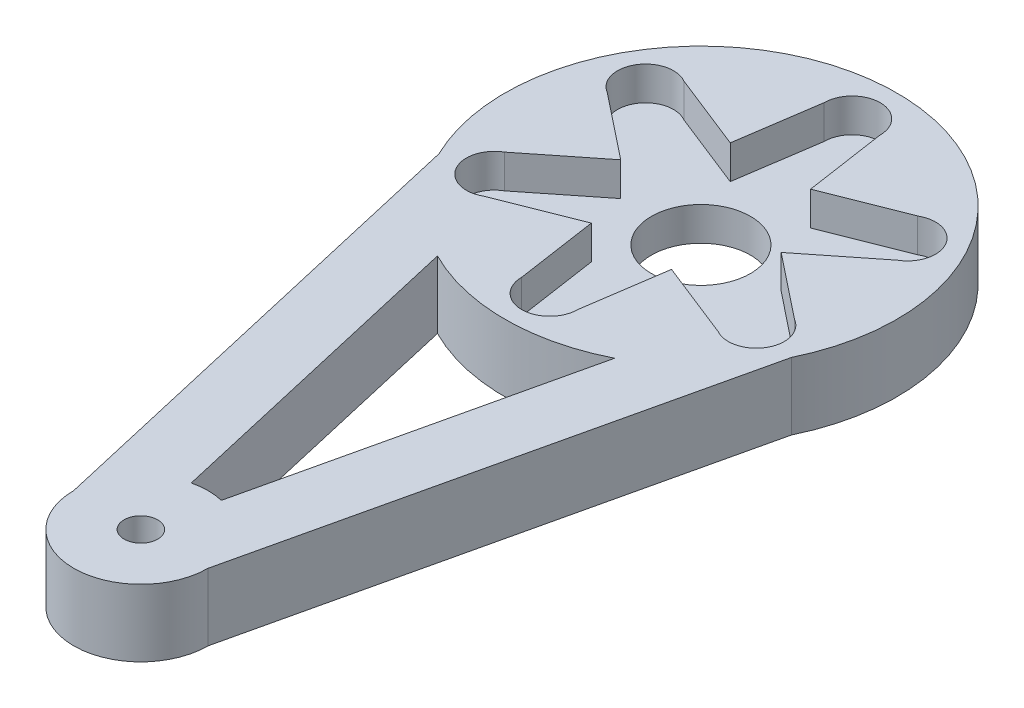
ISO-10303-21;
HEADER;
FILE_DESCRIPTION(('STEP AP214'),'2;1');
FILE_NAME('part.step','',(''),(''),'','','');
FILE_SCHEMA(('AUTOMOTIVE_DESIGN { 1 0 10303 214 1 1 1 1 }'));
ENDSEC;
DATA;
#1=APPLICATION_CONTEXT('core data for automotive mechanical design processes');
#2=APPLICATION_PROTOCOL_DEFINITION('international standard','automotive_design',2000,#1);
#3=PRODUCT_CONTEXT('',#1,'mechanical');
#4=PRODUCT('Part','Part','',(#3));
#5=PRODUCT_RELATED_PRODUCT_CATEGORY('part','',(#4));
#6=PRODUCT_DEFINITION_FORMATION('','',#4);
#7=PRODUCT_DEFINITION_CONTEXT('part definition',#1,'design');
#8=PRODUCT_DEFINITION('design','',#6,#7);
#9=PRODUCT_DEFINITION_SHAPE('','',#8);
#10=(LENGTH_UNIT() NAMED_UNIT(*) SI_UNIT(.MILLI.,.METRE.));
#11=(NAMED_UNIT(*) PLANE_ANGLE_UNIT() SI_UNIT($,.RADIAN.));
#12=(NAMED_UNIT(*) SI_UNIT($,.STERADIAN.) SOLID_ANGLE_UNIT());
#13=UNCERTAINTY_MEASURE_WITH_UNIT(LENGTH_MEASURE(1.E-05),#10,'distance_accuracy_value','');
#14=(GEOMETRIC_REPRESENTATION_CONTEXT(3) GLOBAL_UNCERTAINTY_ASSIGNED_CONTEXT((#13)) GLOBAL_UNIT_ASSIGNED_CONTEXT((#10,
#11,#12)) REPRESENTATION_CONTEXT('',''));
#15=CARTESIAN_POINT('',(0.,0.,0.));
#16=DIRECTION('',(0.,0.,1.));
#17=DIRECTION('',(1.,0.,0.));
#18=AXIS2_PLACEMENT_3D('',#15,#16,#17);
#19=CARTESIAN_POINT('',(0.,6.,0.));
#20=DIRECTION('',(0.,-1.,0.));
#21=DIRECTION('',(0.,0.,-1.));
#22=AXIS2_PLACEMENT_3D('',#19,#20,#21);
#23=CYLINDRICAL_SURFACE('',#22,17.5);
#24=DIRECTION('',(0.,-1.,0.));
#25=VECTOR('',#24,1.);
#26=CARTESIAN_POINT('',(15.7415234115301,6.,7.64555038465191));
#27=LINE('',#26,#25);
#28=CARTESIAN_POINT('',(15.7415234115301,6.,7.64555038465191));
#29=VERTEX_POINT('',#28);
#30=CARTESIAN_POINT('',(15.7415234115301,0.,7.64555038465191));
#31=VERTEX_POINT('',#30);
#32=EDGE_CURVE('E286',#29,#31,#27,.T.);
#33=ORIENTED_EDGE('',*,*,#32,.T.);
#34=CARTESIAN_POINT('',(0.,0.,0.));
#35=DIRECTION('',(0.,1.,0.));
#36=DIRECTION('',(0.,0.,1.));
#37=AXIS2_PLACEMENT_3D('',#34,#35,#36);
#38=CIRCLE('',#37,17.5);
#39=CARTESIAN_POINT('',(-15.7415234115301,0.,7.64555038465188));
#40=VERTEX_POINT('',#39);
#41=EDGE_CURVE('E396',#31,#40,#38,.T.);
#42=ORIENTED_EDGE('',*,*,#41,.T.);
#43=DIRECTION('',(0.,-1.,0.));
#44=VECTOR('',#43,1.);
#45=CARTESIAN_POINT('',(-15.7415234115301,6.,7.64555038465191));
#46=LINE('',#45,#44);
#47=CARTESIAN_POINT('',(-15.7415234115301,6.,7.64555038465188));
#48=VERTEX_POINT('',#47);
#49=EDGE_CURVE('E117',#48,#40,#46,.T.);
#50=ORIENTED_EDGE('',*,*,#49,.F.);
#51=CARTESIAN_POINT('',(0.,6.,0.));
#52=DIRECTION('',(0.,1.,0.));
#53=DIRECTION('',(0.,0.,1.));
#54=AXIS2_PLACEMENT_3D('',#51,#52,#53);
#55=CIRCLE('',#54,17.5);
#56=EDGE_CURVE('E442',#29,#48,#55,.T.);
#57=ORIENTED_EDGE('',*,*,#56,.F.);
#58=EDGE_LOOP('',(#33,#42,#50,#57));
#59=FACE_BOUND('',#58,.T.);
#60=ADVANCED_FACE('F94',(#59),#23,.T.);
#61=CARTESIAN_POINT('',(-7.90957870538803,0.,15.6105273678781));
#62=VERTEX_POINT('',#61);
#63=CARTESIAN_POINT('',(7.90957870538804,0.,15.6105273678781));
#64=VERTEX_POINT('',#63);
#65=EDGE_CURVE('E389',#62,#64,#38,.T.);
#66=ORIENTED_EDGE('',*,*,#65,.T.);
#67=DIRECTION('',(0.,-1.,0.));
#68=VECTOR('',#67,1.);
#69=CARTESIAN_POINT('',(7.90957870538803,6.,15.6105273678781));
#70=LINE('',#69,#68);
#71=CARTESIAN_POINT('',(7.90957870538804,6.,15.6105273678781));
#72=VERTEX_POINT('',#71);
#73=EDGE_CURVE('E326',#72,#64,#70,.T.);
#74=ORIENTED_EDGE('',*,*,#73,.F.);
#75=CARTESIAN_POINT('',(-7.90957870538803,6.,15.6105273678781));
#76=VERTEX_POINT('',#75);
#77=EDGE_CURVE('E109',#76,#72,#55,.T.);
#78=ORIENTED_EDGE('',*,*,#77,.F.);
#79=DIRECTION('',(0.,-1.,0.));
#80=VECTOR('',#79,1.);
#81=CARTESIAN_POINT('',(-7.90957870538803,6.,15.6105273678781));
#82=LINE('',#81,#80);
#83=EDGE_CURVE('E333',#76,#62,#82,.T.);
#84=ORIENTED_EDGE('',*,*,#83,.T.);
#85=EDGE_LOOP('',(#66,#74,#78,#84));
#86=FACE_BOUND('',#85,.T.);
#87=ADVANCED_FACE('F569',(#86),#23,.T.);
#88=CARTESIAN_POINT('',(-11.6913429510899,6.,-6.74999999999999));
#89=DIRECTION('',(0.,-1.,0.));
#90=DIRECTION('',(0.,0.,-1.));
#91=AXIS2_PLACEMENT_3D('',#88,#89,#90);
#92=CYLINDRICAL_SURFACE('',#91,2.5);
#93=CARTESIAN_POINT('',(-11.6913429510899,3.,-6.74999999999999));
#94=DIRECTION('',(0.,1.,0.));
#95=DIRECTION('',(0.,0.,1.));
#96=AXIS2_PLACEMENT_3D('',#93,#94,#95);
#97=CIRCLE('',#96,2.5);
#98=CARTESIAN_POINT('',(-10.4413429510899,3.,-8.91506350946109));
#99=VERTEX_POINT('',#98);
#100=CARTESIAN_POINT('',(-12.9413429510899,3.,-4.58493649053889));
#101=VERTEX_POINT('',#100);
#102=EDGE_CURVE('E363',#99,#101,#97,.T.);
#103=ORIENTED_EDGE('',*,*,#102,.F.);
#104=DIRECTION('',(0.,-1.,0.));
#105=VECTOR('',#104,1.);
#106=CARTESIAN_POINT('',(-10.4413429510899,6.,-8.91506350946109));
#107=LINE('',#106,#105);
#108=CARTESIAN_POINT('',(-10.4413429510899,6.,-8.91506350946109));
#109=VERTEX_POINT('',#108);
#110=EDGE_CURVE('E12',#109,#99,#107,.T.);
#111=ORIENTED_EDGE('',*,*,#110,.F.);
#112=CARTESIAN_POINT('',(-11.6913429510899,6.,-6.74999999999999));
#113=DIRECTION('',(0.,1.,0.));
#114=DIRECTION('',(0.,0.,1.));
#115=AXIS2_PLACEMENT_3D('',#112,#113,#114);
#116=CIRCLE('',#115,2.5);
#117=CARTESIAN_POINT('',(-12.9413429510899,6.,-4.58493649053889));
#118=VERTEX_POINT('',#117);
#119=EDGE_CURVE('E392',#109,#118,#116,.T.);
#120=ORIENTED_EDGE('',*,*,#119,.T.);
#121=DIRECTION('',(0.,-1.,0.));
#122=VECTOR('',#121,1.);
#123=CARTESIAN_POINT('',(-12.9413429510899,6.,-4.58493649053889));
#124=LINE('',#123,#122);
#125=EDGE_CURVE('E444',#118,#101,#124,.T.);
#126=ORIENTED_EDGE('',*,*,#125,.T.);
#127=EDGE_LOOP('',(#103,#111,#120,#126));
#128=FACE_BOUND('',#127,.T.);
#129=ADVANCED_FACE('F96',(#128),#92,.F.);
#130=CARTESIAN_POINT('',(1.63672705202787,6.,-4.13959239881188));
#131=DIRECTION('',(0.367686867782864,0.,-0.929949658454707));
#132=DIRECTION('',(-0.929949658454707,0.,-0.367686867782864));
#133=AXIS2_PLACEMENT_3D('',#130,#131,#132);
#134=PLANE('',#133);
#135=ORIENTED_EDGE('',*,*,#110,.T.);
#136=DIRECTION('',(0.929949658454707,0.,0.367686867782864));
#137=VECTOR('',#136,1.);
#138=CARTESIAN_POINT('',(1.63672705202787,3.,-4.13959239881188));
#139=LINE('',#138,#137);
#140=CARTESIAN_POINT('',(-3.58109149415789,3.,-6.20263241443421));
#141=VERTEX_POINT('',#140);
#142=EDGE_CURVE('E361',#99,#141,#139,.T.);
#143=ORIENTED_EDGE('',*,*,#142,.T.);
#144=DIRECTION('',(0.,-1.,0.));
#145=VECTOR('',#144,1.);
#146=CARTESIAN_POINT('',(-3.58109149415789,6.,-6.20263241443421));
#147=LINE('',#146,#145);
#148=CARTESIAN_POINT('',(-3.58109149415789,6.,-6.20263241443421));
#149=VERTEX_POINT('',#148);
#150=EDGE_CURVE('E102',#149,#141,#147,.T.);
#151=ORIENTED_EDGE('',*,*,#150,.F.);
#152=DIRECTION('',(0.929949658454707,0.,0.367686867782864));
#153=VECTOR('',#152,1.);
#154=CARTESIAN_POINT('',(1.63672705202787,6.,-4.13959239881188));
#155=LINE('',#154,#153);
#156=EDGE_CURVE('E395',#109,#149,#155,.T.);
#157=ORIENTED_EDGE('',*,*,#156,.F.);
#158=EDGE_LOOP('',(#135,#143,#151,#157));
#159=FACE_BOUND('',#158,.T.);
#160=ADVANCED_FACE('F513',(#159),#134,.F.);
#161=CARTESIAN_POINT('',(-4.40335570469799,6.,-0.65234899328859));
#162=DIRECTION('',(0.989203462353871,0.,0.146548661089462));
#163=DIRECTION('',(0.146548661089462,0.,-0.989203462353871));
#164=AXIS2_PLACEMENT_3D('',#161,#162,#163);
#165=PLANE('',#164);
#166=DIRECTION('',(-0.146548661089462,0.,0.989203462353871));
#167=VECTOR('',#166,1.);
#168=CARTESIAN_POINT('',(-4.40335570469799,3.,-0.65234899328859));
#169=LINE('',#168,#167);
#170=CARTESIAN_POINT('',(-2.5,3.,-13.5));
#171=VERTEX_POINT('',#170);
#172=EDGE_CURVE('E358',#171,#141,#169,.T.);
#173=ORIENTED_EDGE('',*,*,#172,.F.);
#174=DIRECTION('',(0.,-1.,0.));
#175=VECTOR('',#174,1.);
#176=CARTESIAN_POINT('',(-2.5,6.,-13.5));
#177=LINE('',#176,#175);
#178=CARTESIAN_POINT('',(-2.5,6.,-13.5));
#179=VERTEX_POINT('',#178);
#180=EDGE_CURVE('E488',#179,#171,#177,.T.);
#181=ORIENTED_EDGE('',*,*,#180,.F.);
#182=DIRECTION('',(-0.146548661089462,0.,0.989203462353871));
#183=VECTOR('',#182,1.);
#184=CARTESIAN_POINT('',(-4.40335570469799,6.,-0.65234899328859));
#185=LINE('',#184,#183);
#186=EDGE_CURVE('E398',#179,#149,#185,.T.);
#187=ORIENTED_EDGE('',*,*,#186,.T.);
#188=ORIENTED_EDGE('',*,*,#150,.T.);
#189=EDGE_LOOP('',(#173,#181,#187,#188));
#190=FACE_BOUND('',#189,.T.);
#191=ADVANCED_FACE('F493',(#190),#165,.T.);
#192=CARTESIAN_POINT('',(0.,6.,-13.5));
#193=DIRECTION('',(0.,-1.,0.));
#194=DIRECTION('',(0.,0.,-1.));
#195=AXIS2_PLACEMENT_3D('',#192,#193,#194);
#196=CYLINDRICAL_SURFACE('',#195,2.5);
#197=CARTESIAN_POINT('',(0.,3.,-13.5));
#198=DIRECTION('',(0.,1.,0.));
#199=DIRECTION('',(0.,0.,1.));
#200=AXIS2_PLACEMENT_3D('',#197,#198,#199);
#201=CIRCLE('',#200,2.5);
#202=CARTESIAN_POINT('',(2.5,3.,-13.5));
#203=VERTEX_POINT('',#202);
#204=EDGE_CURVE('E355',#203,#171,#201,.T.);
#205=ORIENTED_EDGE('',*,*,#204,.F.);
#206=DIRECTION('',(0.,-1.,0.));
#207=VECTOR('',#206,1.);
#208=CARTESIAN_POINT('',(2.5,6.,-13.5));
#209=LINE('',#208,#207);
#210=CARTESIAN_POINT('',(2.5,6.,-13.5));
#211=VERTEX_POINT('',#210);
#212=EDGE_CURVE('E485',#211,#203,#209,.T.);
#213=ORIENTED_EDGE('',*,*,#212,.F.);
#214=CARTESIAN_POINT('',(0.,6.,-13.5));
#215=DIRECTION('',(0.,1.,0.));
#216=DIRECTION('',(0.,0.,1.));
#217=AXIS2_PLACEMENT_3D('',#214,#215,#216);
#218=CIRCLE('',#217,2.5);
#219=EDGE_CURVE('E401',#211,#179,#218,.T.);
#220=ORIENTED_EDGE('',*,*,#219,.T.);
#221=ORIENTED_EDGE('',*,*,#180,.T.);
#222=EDGE_LOOP('',(#205,#213,#220,#221));
#223=FACE_BOUND('',#222,.T.);
#224=ADVANCED_FACE('F503',(#223),#196,.F.);
#225=CARTESIAN_POINT('',(4.40335570469799,6.,-0.65234899328859));
#226=DIRECTION('',(0.989203462353871,0.,-0.146548661089462));
#227=DIRECTION('',(-0.146548661089462,0.,-0.989203462353871));
#228=AXIS2_PLACEMENT_3D('',#225,#226,#227);
#229=PLANE('',#228);
#230=ORIENTED_EDGE('',*,*,#212,.T.);
#231=DIRECTION('',(0.146548661089462,0.,0.989203462353871));
#232=VECTOR('',#231,1.);
#233=CARTESIAN_POINT('',(4.40335570469799,3.,-0.65234899328859));
#234=LINE('',#233,#232);
#235=CARTESIAN_POINT('',(3.58109149415789,3.,-6.20263241443422));
#236=VERTEX_POINT('',#235);
#237=EDGE_CURVE('E353',#203,#236,#234,.T.);
#238=ORIENTED_EDGE('',*,*,#237,.T.);
#239=DIRECTION('',(0.,-1.,0.));
#240=VECTOR('',#239,1.);
#241=CARTESIAN_POINT('',(3.58109149415789,6.,-6.20263241443422));
#242=LINE('',#241,#240);
#243=CARTESIAN_POINT('',(3.58109149415789,6.,-6.20263241443422));
#244=VERTEX_POINT('',#243);
#245=EDGE_CURVE('E482',#244,#236,#242,.T.);
#246=ORIENTED_EDGE('',*,*,#245,.F.);
#247=DIRECTION('',(0.146548661089462,0.,0.989203462353871));
#248=VECTOR('',#247,1.);
#249=CARTESIAN_POINT('',(4.40335570469799,6.,-0.65234899328859));
#250=LINE('',#249,#248);
#251=EDGE_CURVE('E404',#211,#244,#250,.T.);
#252=ORIENTED_EDGE('',*,*,#251,.F.);
#253=EDGE_LOOP('',(#230,#238,#246,#252));
#254=FACE_BOUND('',#253,.T.);
#255=ADVANCED_FACE('F506',(#254),#229,.F.);
#256=CARTESIAN_POINT('',(-1.63672705202787,6.,-4.13959239881188));
#257=DIRECTION('',(0.367686867782865,0.,0.929949658454707));
#258=DIRECTION('',(0.929949658454707,0.,-0.367686867782865));
#259=AXIS2_PLACEMENT_3D('',#256,#257,#258);
#260=PLANE('',#259);
#261=DIRECTION('',(-0.929949658454707,0.,0.367686867782865));
#262=VECTOR('',#261,1.);
#263=CARTESIAN_POINT('',(-1.63672705202787,3.,-4.13959239881188));
#264=LINE('',#263,#262);
#265=CARTESIAN_POINT('',(10.4413429510899,3.,-8.9150635094611));
#266=VERTEX_POINT('',#265);
#267=EDGE_CURVE('E350',#266,#236,#264,.T.);
#268=ORIENTED_EDGE('',*,*,#267,.F.);
#269=DIRECTION('',(0.,-1.,0.));
#270=VECTOR('',#269,1.);
#271=CARTESIAN_POINT('',(10.4413429510899,6.,-8.9150635094611));
#272=LINE('',#271,#270);
#273=CARTESIAN_POINT('',(10.4413429510899,6.,-8.9150635094611));
#274=VERTEX_POINT('',#273);
#275=EDGE_CURVE('E479',#274,#266,#272,.T.);
#276=ORIENTED_EDGE('',*,*,#275,.F.);
#277=DIRECTION('',(-0.929949658454707,0.,0.367686867782865));
#278=VECTOR('',#277,1.);
#279=CARTESIAN_POINT('',(-1.63672705202787,6.,-4.13959239881188));
#280=LINE('',#279,#278);
#281=EDGE_CURVE('E406',#274,#244,#280,.T.);
#282=ORIENTED_EDGE('',*,*,#281,.T.);
#283=ORIENTED_EDGE('',*,*,#245,.T.);
#284=EDGE_LOOP('',(#268,#276,#282,#283));
#285=FACE_BOUND('',#284,.T.);
#286=ADVANCED_FACE('F559',(#285),#260,.T.);
#287=CARTESIAN_POINT('',(11.6913429510899,6.,-6.75));
#288=DIRECTION('',(0.,-1.,0.));
#289=DIRECTION('',(0.,0.,-1.));
#290=AXIS2_PLACEMENT_3D('',#287,#288,#289);
#291=CYLINDRICAL_SURFACE('',#290,2.5);
#292=CARTESIAN_POINT('',(11.6913429510899,3.,-6.75));
#293=DIRECTION('',(0.,1.,0.));
#294=DIRECTION('',(0.,0.,1.));
#295=AXIS2_PLACEMENT_3D('',#292,#293,#294);
#296=CIRCLE('',#295,2.5);
#297=CARTESIAN_POINT('',(12.9413429510899,3.,-4.58493649053891));
#298=VERTEX_POINT('',#297);
#299=EDGE_CURVE('E347',#298,#266,#296,.T.);
#300=ORIENTED_EDGE('',*,*,#299,.F.);
#301=DIRECTION('',(0.,-1.,0.));
#302=VECTOR('',#301,1.);
#303=CARTESIAN_POINT('',(12.9413429510899,6.,-4.58493649053891));
#304=LINE('',#303,#302);
#305=CARTESIAN_POINT('',(12.9413429510899,6.,-4.58493649053891));
#306=VERTEX_POINT('',#305);
#307=EDGE_CURVE('E476',#306,#298,#304,.T.);
#308=ORIENTED_EDGE('',*,*,#307,.F.);
#309=CARTESIAN_POINT('',(11.6913429510899,6.,-6.75));
#310=DIRECTION('',(0.,1.,0.));
#311=DIRECTION('',(0.,0.,1.));
#312=AXIS2_PLACEMENT_3D('',#309,#310,#311);
#313=CIRCLE('',#312,2.5);
#314=EDGE_CURVE('E409',#306,#274,#313,.T.);
#315=ORIENTED_EDGE('',*,*,#314,.T.);
#316=ORIENTED_EDGE('',*,*,#275,.T.);
#317=EDGE_LOOP('',(#300,#308,#315,#316));
#318=FACE_BOUND('',#317,.T.);
#319=ADVANCED_FACE('F557',(#318),#291,.F.);
#320=CARTESIAN_POINT('',(2.76662865267012,6.,3.48724340552329));
#321=DIRECTION('',(0.621516594571006,0.,0.783400997365245));
#322=DIRECTION('',(0.783400997365244,0.,-0.621516594571006));
#323=AXIS2_PLACEMENT_3D('',#320,#321,#322);
#324=PLANE('',#323);
#325=ORIENTED_EDGE('',*,*,#307,.T.);
#326=DIRECTION('',(-0.783400997365245,0.,0.621516594571006));
#327=VECTOR('',#326,1.);
#328=CARTESIAN_POINT('',(2.76662865267012,3.,3.48724340552329));
#329=LINE('',#328,#327);
#330=CARTESIAN_POINT('',(7.16218298831579,3.,0.));
#331=VERTEX_POINT('',#330);
#332=EDGE_CURVE('E345',#298,#331,#329,.T.);
#333=ORIENTED_EDGE('',*,*,#332,.T.);
#334=DIRECTION('',(0.,-1.,0.));
#335=VECTOR('',#334,1.);
#336=CARTESIAN_POINT('',(7.16218298831579,6.,0.));
#337=LINE('',#336,#335);
#338=CARTESIAN_POINT('',(7.16218298831579,6.,0.));
#339=VERTEX_POINT('',#338);
#340=EDGE_CURVE('E473',#339,#331,#337,.T.);
#341=ORIENTED_EDGE('',*,*,#340,.F.);
#342=DIRECTION('',(-0.783400997365245,0.,0.621516594571006));
#343=VECTOR('',#342,1.);
#344=CARTESIAN_POINT('',(2.76662865267012,6.,3.48724340552329));
#345=LINE('',#344,#343);
#346=EDGE_CURVE('E412',#306,#339,#345,.T.);
#347=ORIENTED_EDGE('',*,*,#346,.F.);
#348=EDGE_LOOP('',(#325,#333,#341,#347));
#349=FACE_BOUND('',#348,.T.);
#350=ADVANCED_FACE('F554',(#349),#324,.F.);
#351=CARTESIAN_POINT('',(2.76662865267012,6.,-3.48724340552329));
#352=DIRECTION('',(-0.621516594571006,0.,0.783400997365244));
#353=DIRECTION('',(0.783400997365245,0.,0.621516594571006));
#354=AXIS2_PLACEMENT_3D('',#351,#352,#353);
#355=PLANE('',#354);
#356=DIRECTION('',(-0.783400997365245,0.,-0.621516594571006));
#357=VECTOR('',#356,1.);
#358=CARTESIAN_POINT('',(2.76662865267012,3.,-3.48724340552329));
#359=LINE('',#358,#357);
#360=CARTESIAN_POINT('',(12.9413429510899,3.,4.5849364905389));
#361=VERTEX_POINT('',#360);
#362=EDGE_CURVE('E342',#361,#331,#359,.T.);
#363=ORIENTED_EDGE('',*,*,#362,.F.);
#364=DIRECTION('',(0.,-1.,0.));
#365=VECTOR('',#364,1.);
#366=CARTESIAN_POINT('',(12.9413429510899,6.,4.5849364905389));
#367=LINE('',#366,#365);
#368=CARTESIAN_POINT('',(12.9413429510899,6.,4.5849364905389));
#369=VERTEX_POINT('',#368);
#370=EDGE_CURVE('E470',#369,#361,#367,.T.);
#371=ORIENTED_EDGE('',*,*,#370,.F.);
#372=DIRECTION('',(-0.783400997365245,0.,-0.621516594571006));
#373=VECTOR('',#372,1.);
#374=CARTESIAN_POINT('',(2.76662865267012,6.,-3.48724340552329));
#375=LINE('',#374,#373);
#376=EDGE_CURVE('E414',#369,#339,#375,.T.);
#377=ORIENTED_EDGE('',*,*,#376,.T.);
#378=ORIENTED_EDGE('',*,*,#340,.T.);
#379=EDGE_LOOP('',(#363,#371,#377,#378));
#380=FACE_BOUND('',#379,.T.);
#381=ADVANCED_FACE('F549',(#380),#355,.T.);
#382=CARTESIAN_POINT('',(11.6913429510899,6.,6.75));
#383=DIRECTION('',(0.,-1.,0.));
#384=DIRECTION('',(0.,0.,-1.));
#385=AXIS2_PLACEMENT_3D('',#382,#383,#384);
#386=CYLINDRICAL_SURFACE('',#385,2.5);
#387=CARTESIAN_POINT('',(11.6913429510899,3.,6.75));
#388=DIRECTION('',(0.,1.,0.));
#389=DIRECTION('',(0.,0.,1.));
#390=AXIS2_PLACEMENT_3D('',#387,#388,#389);
#391=CIRCLE('',#390,2.5);
#392=CARTESIAN_POINT('',(10.4413429510899,3.,8.9150635094611));
#393=VERTEX_POINT('',#392);
#394=EDGE_CURVE('E339',#393,#361,#391,.T.);
#395=ORIENTED_EDGE('',*,*,#394,.F.);
#396=DIRECTION('',(0.,-1.,0.));
#397=VECTOR('',#396,1.);
#398=CARTESIAN_POINT('',(10.4413429510899,6.,8.9150635094611));
#399=LINE('',#398,#397);
#400=CARTESIAN_POINT('',(10.4413429510899,6.,8.9150635094611));
#401=VERTEX_POINT('',#400);
#402=EDGE_CURVE('E467',#401,#393,#399,.T.);
#403=ORIENTED_EDGE('',*,*,#402,.F.);
#404=CARTESIAN_POINT('',(11.6913429510899,6.,6.75));
#405=DIRECTION('',(0.,1.,0.));
#406=DIRECTION('',(0.,0.,1.));
#407=AXIS2_PLACEMENT_3D('',#404,#405,#406);
#408=CIRCLE('',#407,2.5);
#409=EDGE_CURVE('E417',#401,#369,#408,.T.);
#410=ORIENTED_EDGE('',*,*,#409,.T.);
#411=ORIENTED_EDGE('',*,*,#370,.T.);
#412=EDGE_LOOP('',(#395,#403,#410,#411));
#413=FACE_BOUND('',#412,.T.);
#414=ADVANCED_FACE('F546',(#413),#386,.F.);
#415=CARTESIAN_POINT('',(-1.63672705202787,6.,4.13959239881188));
#416=DIRECTION('',(-0.367686867782865,0.,0.929949658454707));
#417=DIRECTION('',(0.929949658454707,0.,0.367686867782865));
#418=AXIS2_PLACEMENT_3D('',#415,#416,#417);
#419=PLANE('',#418);
#420=ORIENTED_EDGE('',*,*,#402,.T.);
#421=DIRECTION('',(-0.929949658454707,0.,-0.367686867782865));
#422=VECTOR('',#421,1.);
#423=CARTESIAN_POINT('',(-1.63672705202787,3.,4.13959239881188));
#424=LINE('',#423,#422);
#425=CARTESIAN_POINT('',(3.58109149415789,3.,6.20263241443421));
#426=VERTEX_POINT('',#425);
#427=EDGE_CURVE('E337',#393,#426,#424,.T.);
#428=ORIENTED_EDGE('',*,*,#427,.T.);
#429=DIRECTION('',(0.,-1.,0.));
#430=VECTOR('',#429,1.);
#431=CARTESIAN_POINT('',(3.58109149415789,6.,6.20263241443421));
#432=LINE('',#431,#430);
#433=CARTESIAN_POINT('',(3.58109149415789,6.,6.20263241443421));
#434=VERTEX_POINT('',#433);
#435=EDGE_CURVE('E464',#434,#426,#432,.T.);
#436=ORIENTED_EDGE('',*,*,#435,.F.);
#437=DIRECTION('',(-0.929949658454707,0.,-0.367686867782865));
#438=VECTOR('',#437,1.);
#439=CARTESIAN_POINT('',(-1.63672705202787,6.,4.13959239881188));
#440=LINE('',#439,#438);
#441=EDGE_CURVE('E420',#401,#434,#440,.T.);
#442=ORIENTED_EDGE('',*,*,#441,.F.);
#443=EDGE_LOOP('',(#420,#428,#436,#442));
#444=FACE_BOUND('',#443,.T.);
#445=ADVANCED_FACE('F543',(#444),#419,.F.);
#446=CARTESIAN_POINT('',(4.40335570469799,6.,0.65234899328859));
#447=DIRECTION('',(-0.989203462353871,0.,-0.146548661089462));
#448=DIRECTION('',(-0.146548661089462,0.,0.989203462353871));
#449=AXIS2_PLACEMENT_3D('',#446,#447,#448);
#450=PLANE('',#449);
#451=DIRECTION('',(0.146548661089462,0.,-0.989203462353871));
#452=VECTOR('',#451,1.);
#453=CARTESIAN_POINT('',(4.40335570469799,3.,0.65234899328859));
#454=LINE('',#453,#452);
#455=CARTESIAN_POINT('',(2.5,3.,13.5));
#456=VERTEX_POINT('',#455);
#457=EDGE_CURVE('E383',#456,#426,#454,.T.);
#458=ORIENTED_EDGE('',*,*,#457,.F.);
#459=DIRECTION('',(0.,-1.,0.));
#460=VECTOR('',#459,1.);
#461=CARTESIAN_POINT('',(2.5,6.,13.5));
#462=LINE('',#461,#460);
#463=CARTESIAN_POINT('',(2.5,6.,13.5));
#464=VERTEX_POINT('',#463);
#465=EDGE_CURVE('E461',#464,#456,#462,.T.);
#466=ORIENTED_EDGE('',*,*,#465,.F.);
#467=DIRECTION('',(0.146548661089462,0.,-0.989203462353871));
#468=VECTOR('',#467,1.);
#469=CARTESIAN_POINT('',(4.40335570469799,6.,0.65234899328859));
#470=LINE('',#469,#468);
#471=EDGE_CURVE('E422',#464,#434,#470,.T.);
#472=ORIENTED_EDGE('',*,*,#471,.T.);
#473=ORIENTED_EDGE('',*,*,#435,.T.);
#474=EDGE_LOOP('',(#458,#466,#472,#473));
#475=FACE_BOUND('',#474,.T.);
#476=ADVANCED_FACE('F538',(#475),#450,.T.);
#477=CARTESIAN_POINT('',(0.,6.,13.5));
#478=DIRECTION('',(0.,-1.,0.));
#479=DIRECTION('',(0.,0.,-1.));
#480=AXIS2_PLACEMENT_3D('',#477,#478,#479);
#481=CYLINDRICAL_SURFACE('',#480,2.5);
#482=CARTESIAN_POINT('',(0.,3.,13.5));
#483=DIRECTION('',(0.,1.,0.));
#484=DIRECTION('',(0.,0.,1.));
#485=AXIS2_PLACEMENT_3D('',#482,#483,#484);
#486=CIRCLE('',#485,2.5);
#487=CARTESIAN_POINT('',(-2.5,3.,13.5));
#488=VERTEX_POINT('',#487);
#489=EDGE_CURVE('E380',#488,#456,#486,.T.);
#490=ORIENTED_EDGE('',*,*,#489,.F.);
#491=DIRECTION('',(0.,-1.,0.));
#492=VECTOR('',#491,1.);
#493=CARTESIAN_POINT('',(-2.5,6.,13.5));
#494=LINE('',#493,#492);
#495=CARTESIAN_POINT('',(-2.5,6.,13.5));
#496=VERTEX_POINT('',#495);
#497=EDGE_CURVE('E458',#496,#488,#494,.T.);
#498=ORIENTED_EDGE('',*,*,#497,.F.);
#499=CARTESIAN_POINT('',(0.,6.,13.5));
#500=DIRECTION('',(0.,1.,0.));
#501=DIRECTION('',(0.,0.,1.));
#502=AXIS2_PLACEMENT_3D('',#499,#500,#501);
#503=CIRCLE('',#502,2.5);
#504=EDGE_CURVE('E425',#496,#464,#503,.T.);
#505=ORIENTED_EDGE('',*,*,#504,.T.);
#506=ORIENTED_EDGE('',*,*,#465,.T.);
#507=EDGE_LOOP('',(#490,#498,#505,#506));
#508=FACE_BOUND('',#507,.T.);
#509=ADVANCED_FACE('F535',(#508),#481,.F.);
#510=CARTESIAN_POINT('',(-4.40335570469799,6.,0.652348993288591));
#511=DIRECTION('',(-0.989203462353871,0.,0.146548661089462));
#512=DIRECTION('',(0.146548661089462,0.,0.989203462353871));
#513=AXIS2_PLACEMENT_3D('',#510,#511,#512);
#514=PLANE('',#513);
#515=ORIENTED_EDGE('',*,*,#497,.T.);
#516=DIRECTION('',(-0.146548661089462,0.,-0.989203462353871));
#517=VECTOR('',#516,1.);
#518=CARTESIAN_POINT('',(-4.40335570469799,3.,0.652348993288591));
#519=LINE('',#518,#517);
#520=CARTESIAN_POINT('',(-3.58109149415789,3.,6.20263241443422));
#521=VERTEX_POINT('',#520);
#522=EDGE_CURVE('E378',#488,#521,#519,.T.);
#523=ORIENTED_EDGE('',*,*,#522,.T.);
#524=DIRECTION('',(0.,-1.,0.));
#525=VECTOR('',#524,1.);
#526=CARTESIAN_POINT('',(-3.58109149415789,6.,6.20263241443422));
#527=LINE('',#526,#525);
#528=CARTESIAN_POINT('',(-3.58109149415789,6.,6.20263241443422));
#529=VERTEX_POINT('',#528);
#530=EDGE_CURVE('E455',#529,#521,#527,.T.);
#531=ORIENTED_EDGE('',*,*,#530,.F.);
#532=DIRECTION('',(-0.146548661089462,0.,-0.989203462353871));
#533=VECTOR('',#532,1.);
#534=CARTESIAN_POINT('',(-4.40335570469799,6.,0.652348993288591));
#535=LINE('',#534,#533);
#536=EDGE_CURVE('E428',#496,#529,#535,.T.);
#537=ORIENTED_EDGE('',*,*,#536,.F.);
#538=EDGE_LOOP('',(#515,#523,#531,#537));
#539=FACE_BOUND('',#538,.T.);
#540=ADVANCED_FACE('F532',(#539),#514,.F.);
#541=CARTESIAN_POINT('',(1.63672705202787,6.,4.13959239881188));
#542=DIRECTION('',(-0.367686867782865,0.,-0.929949658454707));
#543=DIRECTION('',(-0.929949658454707,0.,0.367686867782865));
#544=AXIS2_PLACEMENT_3D('',#541,#542,#543);
#545=PLANE('',#544);
#546=DIRECTION('',(0.929949658454707,0.,-0.367686867782865));
#547=VECTOR('',#546,1.);
#548=CARTESIAN_POINT('',(1.63672705202787,3.,4.13959239881188));
#549=LINE('',#548,#547);
#550=CARTESIAN_POINT('',(-10.4413429510899,3.,8.9150635094611));
#551=VERTEX_POINT('',#550);
#552=EDGE_CURVE('E375',#551,#521,#549,.T.);
#553=ORIENTED_EDGE('',*,*,#552,.F.);
#554=DIRECTION('',(0.,-1.,0.));
#555=VECTOR('',#554,1.);
#556=CARTESIAN_POINT('',(-10.4413429510899,6.,8.9150635094611));
#557=LINE('',#556,#555);
#558=CARTESIAN_POINT('',(-10.4413429510899,6.,8.9150635094611));
#559=VERTEX_POINT('',#558);
#560=EDGE_CURVE('E452',#559,#551,#557,.T.);
#561=ORIENTED_EDGE('',*,*,#560,.F.);
#562=DIRECTION('',(0.929949658454707,0.,-0.367686867782865));
#563=VECTOR('',#562,1.);
#564=CARTESIAN_POINT('',(1.63672705202787,6.,4.13959239881188));
#565=LINE('',#564,#563);
#566=EDGE_CURVE('E430',#559,#529,#565,.T.);
#567=ORIENTED_EDGE('',*,*,#566,.T.);
#568=ORIENTED_EDGE('',*,*,#530,.T.);
#569=EDGE_LOOP('',(#553,#561,#567,#568));
#570=FACE_BOUND('',#569,.T.);
#571=ADVANCED_FACE('F527',(#570),#545,.T.);
#572=CARTESIAN_POINT('',(-11.6913429510899,6.,6.75000000000001));
#573=DIRECTION('',(0.,-1.,0.));
#574=DIRECTION('',(0.,0.,-1.));
#575=AXIS2_PLACEMENT_3D('',#572,#573,#574);
#576=CYLINDRICAL_SURFACE('',#575,2.5);
#577=CARTESIAN_POINT('',(-11.6913429510899,3.,6.75000000000001));
#578=DIRECTION('',(0.,1.,0.));
#579=DIRECTION('',(0.,0.,1.));
#580=AXIS2_PLACEMENT_3D('',#577,#578,#579);
#581=CIRCLE('',#580,2.5);
#582=CARTESIAN_POINT('',(-12.9413429510899,3.,4.58493649053891));
#583=VERTEX_POINT('',#582);
#584=EDGE_CURVE('E372',#583,#551,#581,.T.);
#585=ORIENTED_EDGE('',*,*,#584,.F.);
#586=DIRECTION('',(0.,-1.,0.));
#587=VECTOR('',#586,1.);
#588=CARTESIAN_POINT('',(-12.9413429510899,6.,4.58493649053891));
#589=LINE('',#588,#587);
#590=CARTESIAN_POINT('',(-12.9413429510899,6.,4.58493649053891));
#591=VERTEX_POINT('',#590);
#592=EDGE_CURVE('E449',#591,#583,#589,.T.);
#593=ORIENTED_EDGE('',*,*,#592,.F.);
#594=CARTESIAN_POINT('',(-11.6913429510899,6.,6.75000000000001));
#595=DIRECTION('',(0.,1.,0.));
#596=DIRECTION('',(0.,0.,1.));
#597=AXIS2_PLACEMENT_3D('',#594,#595,#596);
#598=CIRCLE('',#597,2.5);
#599=EDGE_CURVE('E433',#591,#559,#598,.T.);
#600=ORIENTED_EDGE('',*,*,#599,.T.);
#601=ORIENTED_EDGE('',*,*,#560,.T.);
#602=EDGE_LOOP('',(#585,#593,#600,#601));
#603=FACE_BOUND('',#602,.T.);
#604=ADVANCED_FACE('F524',(#603),#576,.F.);
#605=CARTESIAN_POINT('',(-2.76662865267012,6.,-3.48724340552329));
#606=DIRECTION('',(-0.621516594571006,0.,-0.783400997365244));
#607=DIRECTION('',(-0.783400997365245,0.,0.621516594571006));
#608=AXIS2_PLACEMENT_3D('',#605,#606,#607);
#609=PLANE('',#608);
#610=ORIENTED_EDGE('',*,*,#592,.T.);
#611=DIRECTION('',(0.783400997365244,0.,-0.621516594571006));
#612=VECTOR('',#611,1.);
#613=CARTESIAN_POINT('',(-2.76662865267012,3.,-3.48724340552329));
#614=LINE('',#613,#612);
#615=CARTESIAN_POINT('',(-7.16218298831579,3.,0.));
#616=VERTEX_POINT('',#615);
#617=EDGE_CURVE('E369',#583,#616,#614,.T.);
#618=ORIENTED_EDGE('',*,*,#617,.T.);
#619=DIRECTION('',(0.,-1.,0.));
#620=VECTOR('',#619,1.);
#621=CARTESIAN_POINT('',(-7.16218298831579,6.,0.));
#622=LINE('',#621,#620);
#623=CARTESIAN_POINT('',(-7.16218298831579,6.,0.));
#624=VERTEX_POINT('',#623);
#625=EDGE_CURVE('E447',#624,#616,#622,.T.);
#626=ORIENTED_EDGE('',*,*,#625,.F.);
#627=DIRECTION('',(0.783400997365244,0.,-0.621516594571006));
#628=VECTOR('',#627,1.);
#629=CARTESIAN_POINT('',(-2.76662865267012,6.,-3.48724340552329));
#630=LINE('',#629,#628);
#631=EDGE_CURVE('E436',#591,#624,#630,.T.);
#632=ORIENTED_EDGE('',*,*,#631,.F.);
#633=EDGE_LOOP('',(#610,#618,#626,#632));
#634=FACE_BOUND('',#633,.T.);
#635=ADVANCED_FACE('F521',(#634),#609,.F.);
#636=CARTESIAN_POINT('',(-2.76662865267012,6.,3.48724340552329));
#637=DIRECTION('',(0.621516594571005,0.,-0.783400997365245));
#638=DIRECTION('',(-0.783400997365245,0.,-0.621516594571005));
#639=AXIS2_PLACEMENT_3D('',#636,#637,#638);
#640=PLANE('',#639);
#641=DIRECTION('',(0.783400997365245,0.,0.621516594571005));
#642=VECTOR('',#641,1.);
#643=CARTESIAN_POINT('',(-2.76662865267012,3.,3.48724340552329));
#644=LINE('',#643,#642);
#645=EDGE_CURVE('E366',#101,#616,#644,.T.);
#646=ORIENTED_EDGE('',*,*,#645,.F.);
#647=ORIENTED_EDGE('',*,*,#125,.F.);
#648=DIRECTION('',(0.783400997365245,0.,0.621516594571005));
#649=VECTOR('',#648,1.);
#650=CARTESIAN_POINT('',(-2.76662865267012,6.,3.48724340552329));
#651=LINE('',#650,#649);
#652=EDGE_CURVE('E438',#118,#624,#651,.T.);
#653=ORIENTED_EDGE('',*,*,#652,.T.);
#654=ORIENTED_EDGE('',*,*,#625,.T.);
#655=EDGE_LOOP('',(#646,#647,#653,#654));
#656=FACE_BOUND('',#655,.T.);
#657=ADVANCED_FACE('F517',(#656),#640,.T.);
#658=CARTESIAN_POINT('',(0.,6.,0.));
#659=DIRECTION('',(0.,1.,0.));
#660=DIRECTION('',(0.,0.,1.));
#661=AXIS2_PLACEMENT_3D('',#658,#659,#660);
#662=PLANE('',#661);
#663=DIRECTION('',(0.224147692921427,0.,-0.9745551866149));
#664=VECTOR('',#663,1.);
#665=CARTESIAN_POINT('',(16.620761705765,6.,3.82277519232596));
#666=LINE('',#665,#664);
#667=CARTESIAN_POINT('',(6.,6.,50.));
#668=VERTEX_POINT('',#667);
#669=EDGE_CURVE('E283',#668,#29,#666,.T.);
#670=ORIENTED_EDGE('',*,*,#669,.T.);
#671=ORIENTED_EDGE('',*,*,#56,.T.);
#672=DIRECTION('',(0.224147692921427,0.,0.9745551866149));
#673=VECTOR('',#672,1.);
#674=CARTESIAN_POINT('',(-16.620761705765,6.,3.82277519232596));
#675=LINE('',#674,#673);
#676=CARTESIAN_POINT('',(-6.,6.,50.));
#677=VERTEX_POINT('',#676);
#678=EDGE_CURVE('E293',#48,#677,#675,.T.);
#679=ORIENTED_EDGE('',*,*,#678,.T.);
#680=CARTESIAN_POINT('',(0.,6.,50.));
#681=DIRECTION('',(0.,-1.,0.));
#682=DIRECTION('',(0.,0.,-1.));
#683=AXIS2_PLACEMENT_3D('',#680,#681,#682);
#684=CIRCLE('',#683,6.);
#685=EDGE_CURVE('E272',#668,#677,#684,.T.);
#686=ORIENTED_EDGE('',*,*,#685,.F.);
#687=EDGE_LOOP('',(#670,#671,#679,#686));
#688=FACE_BOUND('',#687,.T.);
#689=ORIENTED_EDGE('',*,*,#119,.F.);
#690=ORIENTED_EDGE('',*,*,#156,.T.);
#691=ORIENTED_EDGE('',*,*,#186,.F.);
#692=ORIENTED_EDGE('',*,*,#219,.F.);
#693=ORIENTED_EDGE('',*,*,#251,.T.);
#694=ORIENTED_EDGE('',*,*,#281,.F.);
#695=ORIENTED_EDGE('',*,*,#314,.F.);
#696=ORIENTED_EDGE('',*,*,#346,.T.);
#697=ORIENTED_EDGE('',*,*,#376,.F.);
#698=ORIENTED_EDGE('',*,*,#409,.F.);
#699=ORIENTED_EDGE('',*,*,#441,.T.);
#700=ORIENTED_EDGE('',*,*,#471,.F.);
#701=ORIENTED_EDGE('',*,*,#504,.F.);
#702=ORIENTED_EDGE('',*,*,#536,.T.);
#703=ORIENTED_EDGE('',*,*,#566,.F.);
#704=ORIENTED_EDGE('',*,*,#599,.F.);
#705=ORIENTED_EDGE('',*,*,#631,.T.);
#706=ORIENTED_EDGE('',*,*,#652,.F.);
#707=EDGE_LOOP('',(#689,#690,#691,#692,#693,#694,#695,#696,#697,#698,#699,#700,#701,#702,#703,
#704,#705,#706));
#708=FACE_BOUND('',#707,.T.);
#709=ORIENTED_EDGE('',*,*,#77,.T.);
#710=DIRECTION('',(0.224147692921427,0.,-0.9745551866149));
#711=VECTOR('',#710,1.);
#712=CARTESIAN_POINT('',(10.922214835217,6.,2.51210941209992));
#713=LINE('',#712,#711);
#714=CARTESIAN_POINT('',(1.34488615752856,6.,44.1526688803106));
#715=VERTEX_POINT('',#714);
#716=EDGE_CURVE('E279',#715,#72,#713,.T.);
#717=ORIENTED_EDGE('',*,*,#716,.F.);
#718=CARTESIAN_POINT('',(0.,6.,50.));
#719=DIRECTION('',(0.,-1.,0.));
#720=DIRECTION('',(0.,0.,-1.));
#721=AXIS2_PLACEMENT_3D('',#718,#719,#720);
#722=CIRCLE('',#721,6.);
#723=CARTESIAN_POINT('',(-1.34488615752856,6.,44.1526688803106));
#724=VERTEX_POINT('',#723);
#725=EDGE_CURVE('E301',#724,#715,#722,.T.);
#726=ORIENTED_EDGE('',*,*,#725,.F.);
#727=DIRECTION('',(-0.224147692921427,0.,-0.9745551866149));
#728=VECTOR('',#727,1.);
#729=CARTESIAN_POINT('',(-10.922214835217,6.,2.51210941209992));
#730=LINE('',#729,#728);
#731=EDGE_CURVE('E296',#724,#76,#730,.T.);
#732=ORIENTED_EDGE('',*,*,#731,.T.);
#733=EDGE_LOOP('',(#709,#717,#726,#732));
#734=FACE_BOUND('',#733,.T.);
#735=CARTESIAN_POINT('',(0.,6.,50.));
#736=DIRECTION('',(0.,-1.,0.));
#737=DIRECTION('',(0.,0.,-1.));
#738=AXIS2_PLACEMENT_3D('',#735,#736,#737);
#739=CIRCLE('',#738,1.5);
#740=CARTESIAN_POINT('',(0.,6.,48.5));
#741=VERTEX_POINT('',#740);
#742=EDGE_CURVE('E288',#741,#741,#739,.T.);
#743=ORIENTED_EDGE('',*,*,#742,.T.);
#744=EDGE_LOOP('',(#743));
#745=FACE_BOUND('',#744,.T.);
#746=ADVANCED_FACE('F290',(#688,#708,#734,#745),#662,.T.);
#747=CARTESIAN_POINT('',(0.,0.,0.));
#748=DIRECTION('',(0.,1.,0.));
#749=DIRECTION('',(0.,0.,1.));
#750=AXIS2_PLACEMENT_3D('',#747,#748,#749);
#751=PLANE('',#750);
#752=ORIENTED_EDGE('',*,*,#41,.F.);
#753=DIRECTION('',(0.224147692921427,0.,-0.9745551866149));
#754=VECTOR('',#753,1.);
#755=CARTESIAN_POINT('',(16.620761705765,0.,3.82277519232596));
#756=LINE('',#755,#754);
#757=CARTESIAN_POINT('',(6.,0.,50.));
#758=VERTEX_POINT('',#757);
#759=EDGE_CURVE('E309',#758,#31,#756,.T.);
#760=ORIENTED_EDGE('',*,*,#759,.F.);
#761=CARTESIAN_POINT('',(0.,0.,50.));
#762=DIRECTION('',(0.,-1.,0.));
#763=DIRECTION('',(0.,0.,-1.));
#764=AXIS2_PLACEMENT_3D('',#761,#762,#763);
#765=CIRCLE('',#764,6.);
#766=CARTESIAN_POINT('',(-6.,0.,50.));
#767=VERTEX_POINT('',#766);
#768=EDGE_CURVE('E274',#758,#767,#765,.T.);
#769=ORIENTED_EDGE('',*,*,#768,.T.);
#770=DIRECTION('',(0.224147692921427,0.,0.9745551866149));
#771=VECTOR('',#770,1.);
#772=CARTESIAN_POINT('',(-16.620761705765,0.,3.82277519232596));
#773=LINE('',#772,#771);
#774=EDGE_CURVE('E312',#40,#767,#773,.T.);
#775=ORIENTED_EDGE('',*,*,#774,.F.);
#776=EDGE_LOOP('',(#752,#760,#769,#775));
#777=FACE_BOUND('',#776,.T.);
#778=DIRECTION('',(0.224147692921427,0.,-0.9745551866149));
#779=VECTOR('',#778,1.);
#780=CARTESIAN_POINT('',(10.922214835217,0.,2.51210941209992));
#781=LINE('',#780,#779);
#782=CARTESIAN_POINT('',(1.34488615752856,0.,44.1526688803106));
#783=VERTEX_POINT('',#782);
#784=EDGE_CURVE('E321',#783,#64,#781,.T.);
#785=ORIENTED_EDGE('',*,*,#784,.T.);
#786=ORIENTED_EDGE('',*,*,#65,.F.);
#787=DIRECTION('',(-0.224147692921427,0.,-0.9745551866149));
#788=VECTOR('',#787,1.);
#789=CARTESIAN_POINT('',(-10.922214835217,0.,2.51210941209992));
#790=LINE('',#789,#788);
#791=CARTESIAN_POINT('',(-1.34488615752856,0.,44.1526688803106));
#792=VERTEX_POINT('',#791);
#793=EDGE_CURVE('E315',#792,#62,#790,.T.);
#794=ORIENTED_EDGE('',*,*,#793,.F.);
#795=CARTESIAN_POINT('',(0.,0.,50.));
#796=DIRECTION('',(0.,-1.,0.));
#797=DIRECTION('',(0.,0.,-1.));
#798=AXIS2_PLACEMENT_3D('',#795,#796,#797);
#799=CIRCLE('',#798,6.);
#800=EDGE_CURVE('E318',#792,#783,#799,.T.);
#801=ORIENTED_EDGE('',*,*,#800,.T.);
#802=EDGE_LOOP('',(#785,#786,#794,#801));
#803=FACE_BOUND('',#802,.T.);
#804=CARTESIAN_POINT('',(0.,0.,0.));
#805=DIRECTION('',(0.,1.,0.));
#806=DIRECTION('',(0.,0.,1.));
#807=AXIS2_PLACEMENT_3D('',#804,#805,#806);
#808=CIRCLE('',#807,4.425);
#809=CARTESIAN_POINT('',(0.,0.,4.425));
#810=VERTEX_POINT('',#809);
#811=EDGE_CURVE('E325',#810,#810,#808,.T.);
#812=ORIENTED_EDGE('',*,*,#811,.T.);
#813=EDGE_LOOP('',(#812));
#814=FACE_BOUND('',#813,.T.);
#815=CARTESIAN_POINT('',(0.,0.,50.));
#816=DIRECTION('',(0.,-1.,0.));
#817=DIRECTION('',(0.,0.,-1.));
#818=AXIS2_PLACEMENT_3D('',#815,#816,#817);
#819=CIRCLE('',#818,1.5);
#820=CARTESIAN_POINT('',(0.,0.,48.5));
#821=VERTEX_POINT('',#820);
#822=EDGE_CURVE('E306',#821,#821,#819,.T.);
#823=ORIENTED_EDGE('',*,*,#822,.F.);
#824=EDGE_LOOP('',(#823));
#825=FACE_BOUND('',#824,.T.);
#826=ADVANCED_FACE('F577',(#777,#803,#814,#825),#751,.F.);
#827=CARTESIAN_POINT('',(0.,3.,0.));
#828=DIRECTION('',(0.,1.,0.));
#829=DIRECTION('',(0.,0.,1.));
#830=AXIS2_PLACEMENT_3D('',#827,#828,#829);
#831=PLANE('',#830);
#832=ORIENTED_EDGE('',*,*,#394,.T.);
#833=ORIENTED_EDGE('',*,*,#362,.T.);
#834=ORIENTED_EDGE('',*,*,#332,.F.);
#835=ORIENTED_EDGE('',*,*,#299,.T.);
#836=ORIENTED_EDGE('',*,*,#267,.T.);
#837=ORIENTED_EDGE('',*,*,#237,.F.);
#838=ORIENTED_EDGE('',*,*,#204,.T.);
#839=ORIENTED_EDGE('',*,*,#172,.T.);
#840=ORIENTED_EDGE('',*,*,#142,.F.);
#841=ORIENTED_EDGE('',*,*,#102,.T.);
#842=ORIENTED_EDGE('',*,*,#645,.T.);
#843=ORIENTED_EDGE('',*,*,#617,.F.);
#844=ORIENTED_EDGE('',*,*,#584,.T.);
#845=ORIENTED_EDGE('',*,*,#552,.T.);
#846=ORIENTED_EDGE('',*,*,#522,.F.);
#847=ORIENTED_EDGE('',*,*,#489,.T.);
#848=ORIENTED_EDGE('',*,*,#457,.T.);
#849=ORIENTED_EDGE('',*,*,#427,.F.);
#850=EDGE_LOOP('',(#832,#833,#834,#835,#836,#837,#838,#839,#840,#841,#842,#843,#844,#845,#846,
#847,#848,#849));
#851=FACE_BOUND('',#850,.T.);
#852=CARTESIAN_POINT('',(0.,3.,0.));
#853=DIRECTION('',(0.,1.,0.));
#854=DIRECTION('',(0.,0.,1.));
#855=AXIS2_PLACEMENT_3D('',#852,#853,#854);
#856=CIRCLE('',#855,4.425);
#857=CARTESIAN_POINT('',(0.,3.,4.425));
#858=VERTEX_POINT('',#857);
#859=EDGE_CURVE('E386',#858,#858,#856,.T.);
#860=ORIENTED_EDGE('',*,*,#859,.F.);
#861=EDGE_LOOP('',(#860));
#862=FACE_BOUND('',#861,.T.);
#863=ADVANCED_FACE('F499',(#851,#862),#831,.T.);
#864=CARTESIAN_POINT('',(0.,3.,0.));
#865=DIRECTION('',(0.,-1.,0.));
#866=DIRECTION('',(0.,0.,-1.));
#867=AXIS2_PLACEMENT_3D('',#864,#865,#866);
#868=CYLINDRICAL_SURFACE('',#867,4.425);
#869=ORIENTED_EDGE('',*,*,#859,.T.);
#870=EDGE_LOOP('',(#869));
#871=FACE_BOUND('',#870,.T.);
#872=ORIENTED_EDGE('',*,*,#811,.F.);
#873=EDGE_LOOP('',(#872));
#874=FACE_BOUND('',#873,.T.);
#875=ADVANCED_FACE('F650',(#871,#874),#868,.F.);
#876=CARTESIAN_POINT('',(16.620761705765,6.,3.82277519232596));
#877=DIRECTION('',(-0.974555186614899,0.,-0.224147692921427));
#878=DIRECTION('',(-0.224147692921427,0.,0.9745551866149));
#879=AXIS2_PLACEMENT_3D('',#876,#877,#878);
#880=PLANE('',#879);
#881=ORIENTED_EDGE('',*,*,#759,.T.);
#882=ORIENTED_EDGE('',*,*,#32,.F.);
#883=ORIENTED_EDGE('',*,*,#669,.F.);
#884=DIRECTION('',(0.,-1.,0.));
#885=VECTOR('',#884,1.);
#886=CARTESIAN_POINT('',(6.,6.,50.));
#887=LINE('',#886,#885);
#888=EDGE_CURVE('E268',#668,#758,#887,.T.);
#889=ORIENTED_EDGE('',*,*,#888,.T.);
#890=EDGE_LOOP('',(#881,#882,#883,#889));
#891=FACE_BOUND('',#890,.T.);
#892=ADVANCED_FACE('F284',(#891),#880,.F.);
#893=CARTESIAN_POINT('',(10.922214835217,6.,2.51210941209992));
#894=DIRECTION('',(-0.974555186614899,0.,-0.224147692921427));
#895=DIRECTION('',(-0.224147692921427,0.,0.9745551866149));
#896=AXIS2_PLACEMENT_3D('',#893,#894,#895);
#897=PLANE('',#896);
#898=ORIENTED_EDGE('',*,*,#784,.F.);
#899=DIRECTION('',(0.,-1.,0.));
#900=VECTOR('',#899,1.);
#901=CARTESIAN_POINT('',(1.34488615752856,6.,44.1526688803106));
#902=LINE('',#901,#900);
#903=EDGE_CURVE('E329',#715,#783,#902,.T.);
#904=ORIENTED_EDGE('',*,*,#903,.F.);
#905=ORIENTED_EDGE('',*,*,#716,.T.);
#906=ORIENTED_EDGE('',*,*,#73,.T.);
#907=EDGE_LOOP('',(#898,#904,#905,#906));
#908=FACE_BOUND('',#907,.T.);
#909=ADVANCED_FACE('F684',(#908),#897,.T.);
#910=CARTESIAN_POINT('',(0.,6.,50.));
#911=DIRECTION('',(0.,-1.,0.));
#912=DIRECTION('',(0.,0.,-1.));
#913=AXIS2_PLACEMENT_3D('',#910,#911,#912);
#914=CYLINDRICAL_SURFACE('',#913,6.);
#915=ORIENTED_EDGE('',*,*,#800,.F.);
#916=DIRECTION('',(0.,-1.,0.));
#917=VECTOR('',#916,1.);
#918=CARTESIAN_POINT('',(-1.34488615752856,6.,44.1526688803106));
#919=LINE('',#918,#917);
#920=EDGE_CURVE('E331',#724,#792,#919,.T.);
#921=ORIENTED_EDGE('',*,*,#920,.F.);
#922=ORIENTED_EDGE('',*,*,#725,.T.);
#923=ORIENTED_EDGE('',*,*,#903,.T.);
#924=EDGE_LOOP('',(#915,#921,#922,#923));
#925=FACE_BOUND('',#924,.T.);
#926=ADVANCED_FACE('F691',(#925),#914,.T.);
#927=CARTESIAN_POINT('',(-10.922214835217,6.,2.51210941209992));
#928=DIRECTION('',(-0.974555186614899,0.,0.224147692921427));
#929=DIRECTION('',(0.224147692921427,0.,0.9745551866149));
#930=AXIS2_PLACEMENT_3D('',#927,#928,#929);
#931=PLANE('',#930);
#932=ORIENTED_EDGE('',*,*,#793,.T.);
#933=ORIENTED_EDGE('',*,*,#83,.F.);
#934=ORIENTED_EDGE('',*,*,#731,.F.);
#935=ORIENTED_EDGE('',*,*,#920,.T.);
#936=EDGE_LOOP('',(#932,#933,#934,#935));
#937=FACE_BOUND('',#936,.T.);
#938=ADVANCED_FACE('F699',(#937),#931,.F.);
#939=CARTESIAN_POINT('',(-16.620761705765,6.,3.82277519232596));
#940=DIRECTION('',(0.974555186614899,0.,-0.224147692921427));
#941=DIRECTION('',(-0.224147692921427,0.,-0.9745551866149));
#942=AXIS2_PLACEMENT_3D('',#939,#940,#941);
#943=PLANE('',#942);
#944=ORIENTED_EDGE('',*,*,#774,.T.);
#945=DIRECTION('',(0.,-1.,0.));
#946=VECTOR('',#945,1.);
#947=CARTESIAN_POINT('',(-6.,6.,50.));
#948=LINE('',#947,#946);
#949=EDGE_CURVE('E278',#677,#767,#948,.T.);
#950=ORIENTED_EDGE('',*,*,#949,.F.);
#951=ORIENTED_EDGE('',*,*,#678,.F.);
#952=ORIENTED_EDGE('',*,*,#49,.T.);
#953=EDGE_LOOP('',(#944,#950,#951,#952));
#954=FACE_BOUND('',#953,.T.);
#955=ADVANCED_FACE('F707',(#954),#943,.F.);
#956=CARTESIAN_POINT('',(0.,6.,50.));
#957=DIRECTION('',(0.,-1.,0.));
#958=DIRECTION('',(0.,0.,-1.));
#959=AXIS2_PLACEMENT_3D('',#956,#957,#958);
#960=CYLINDRICAL_SURFACE('',#959,1.5);
#961=ORIENTED_EDGE('',*,*,#742,.F.);
#962=EDGE_LOOP('',(#961));
#963=FACE_BOUND('',#962,.T.);
#964=ORIENTED_EDGE('',*,*,#822,.T.);
#965=EDGE_LOOP('',(#964));
#966=FACE_BOUND('',#965,.T.);
#967=ADVANCED_FACE('F715',(#963,#966),#960,.F.);
#968=CARTESIAN_POINT('',(0.,6.,50.));
#969=DIRECTION('',(0.,-1.,0.));
#970=DIRECTION('',(0.,0.,-1.));
#971=AXIS2_PLACEMENT_3D('',#968,#969,#970);
#972=CYLINDRICAL_SURFACE('',#971,6.);
#973=ORIENTED_EDGE('',*,*,#768,.F.);
#974=ORIENTED_EDGE('',*,*,#888,.F.);
#975=ORIENTED_EDGE('',*,*,#685,.T.);
#976=ORIENTED_EDGE('',*,*,#949,.T.);
#977=EDGE_LOOP('',(#973,#974,#975,#976));
#978=FACE_BOUND('',#977,.T.);
#979=ADVANCED_FACE('F270',(#978),#972,.T.);
#980=CLOSED_SHELL('',(#60,#87,#129,#160,#191,#224,#255,#286,#319,#350,#381,#414,#445,#476,#509,
#540,#571,#604,#635,#657,#746,#826,#863,#875,#892,#909,#926,#938,#955,#967,#979));
#981=MANIFOLD_SOLID_BREP('B2',#980);
#982=ADVANCED_BREP_SHAPE_REPRESENTATION('',(#18,#981),#14);
#983=SHAPE_DEFINITION_REPRESENTATION(#9,#982);
ENDSEC;
END-ISO-10303-21;
